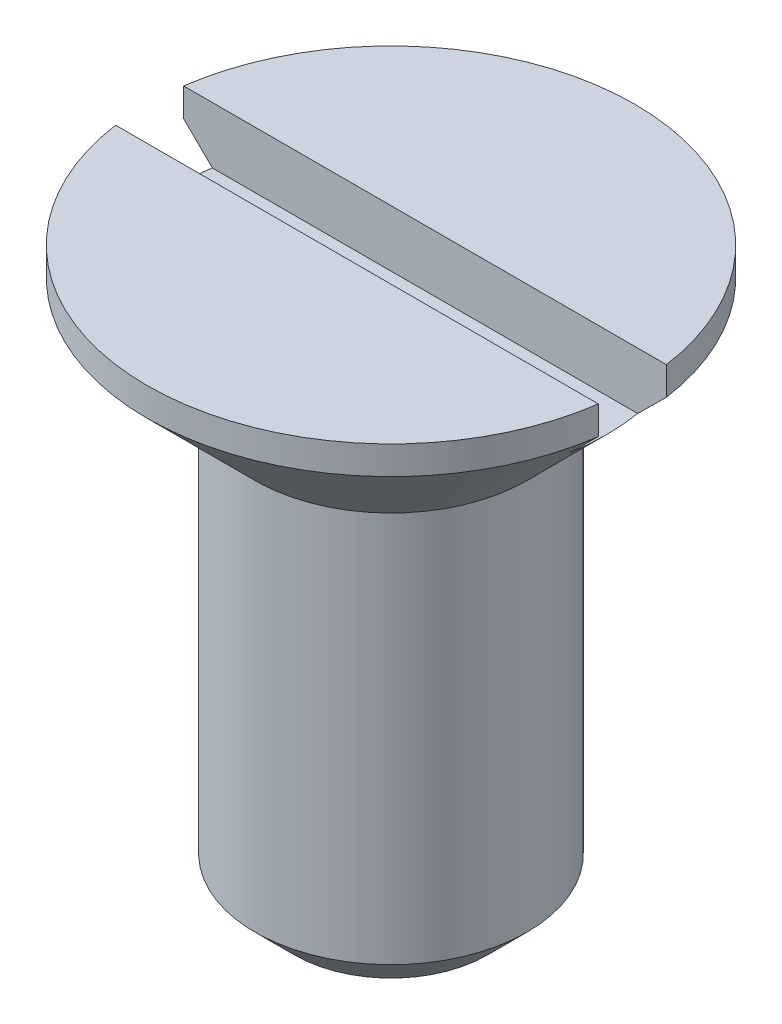
ISO-10303-21;
HEADER;
FILE_DESCRIPTION(('STEP AP214'),'2;1');
FILE_NAME('part.step','',(''),(''),'','','');
FILE_SCHEMA(('AUTOMOTIVE_DESIGN { 1 0 10303 214 1 1 1 1 }'));
ENDSEC;
DATA;
#1=APPLICATION_CONTEXT('core data for automotive mechanical design processes');
#2=APPLICATION_PROTOCOL_DEFINITION('international standard','automotive_design',2000,#1);
#3=PRODUCT_CONTEXT('',#1,'mechanical');
#4=PRODUCT('Part','Part','',(#3));
#5=PRODUCT_RELATED_PRODUCT_CATEGORY('part','',(#4));
#6=PRODUCT_DEFINITION_FORMATION('','',#4);
#7=PRODUCT_DEFINITION_CONTEXT('part definition',#1,'design');
#8=PRODUCT_DEFINITION('design','',#6,#7);
#9=PRODUCT_DEFINITION_SHAPE('','',#8);
#10=(LENGTH_UNIT() NAMED_UNIT(*) SI_UNIT(.MILLI.,.METRE.));
#11=(NAMED_UNIT(*) PLANE_ANGLE_UNIT() SI_UNIT($,.RADIAN.));
#12=(NAMED_UNIT(*) SI_UNIT($,.STERADIAN.) SOLID_ANGLE_UNIT());
#13=UNCERTAINTY_MEASURE_WITH_UNIT(LENGTH_MEASURE(1.E-05),#10,'distance_accuracy_value','');
#14=(GEOMETRIC_REPRESENTATION_CONTEXT(3) GLOBAL_UNCERTAINTY_ASSIGNED_CONTEXT((#13)) GLOBAL_UNIT_ASSIGNED_CONTEXT((#10,
#11,#12)) REPRESENTATION_CONTEXT('',''));
#15=CARTESIAN_POINT('',(0.,0.,0.));
#16=DIRECTION('',(0.,0.,1.));
#17=DIRECTION('',(1.,0.,0.));
#18=AXIS2_PLACEMENT_3D('',#15,#16,#17);
#19=CARTESIAN_POINT('',(0.,125.763182897862,0.));
#20=DIRECTION('',(0.,1.,0.));
#21=DIRECTION('',(-1.,0.,0.));
#22=AXIS2_PLACEMENT_3D('',#19,#20,#21);
#23=CYLINDRICAL_SURFACE('',#22,10.75);
#24=CARTESIAN_POINT('',(0.,90.7850422227854,0.));
#25=DIRECTION('',(0.,1.,0.));
#26=DIRECTION('',(-1.,0.,0.));
#27=AXIS2_PLACEMENT_3D('',#24,#25,#26);
#28=CIRCLE('',#27,10.75);
#29=CARTESIAN_POINT('',(10.6448344280219,90.7850422227854,-1.5));
#30=VERTEX_POINT('',#29);
#31=CARTESIAN_POINT('',(-10.6448344280219,90.7850422227854,-1.5));
#32=VERTEX_POINT('',#31);
#33=EDGE_CURVE('E103',#30,#32,#28,.T.);
#34=ORIENTED_EDGE('',*,*,#33,.T.);
#35=DIRECTION('',(0.,1.,0.));
#36=VECTOR('',#35,1.);
#37=CARTESIAN_POINT('',(-10.6448344280219,125.763182897862,-1.5));
#38=LINE('',#37,#36);
#39=CARTESIAN_POINT('',(-10.6448344280219,92.0350422227854,-1.5));
#40=VERTEX_POINT('',#39);
#41=EDGE_CURVE('E136',#32,#40,#38,.T.);
#42=ORIENTED_EDGE('',*,*,#41,.T.);
#43=CARTESIAN_POINT('',(0.,92.0350422227854,0.));
#44=DIRECTION('',(0.,1.,0.));
#45=DIRECTION('',(-1.,0.,0.));
#46=AXIS2_PLACEMENT_3D('',#43,#44,#45);
#47=CIRCLE('',#46,10.75);
#48=CARTESIAN_POINT('',(10.6448344280219,92.0350422227854,-1.5));
#49=VERTEX_POINT('',#48);
#50=EDGE_CURVE('E100',#49,#40,#47,.T.);
#51=ORIENTED_EDGE('',*,*,#50,.F.);
#52=DIRECTION('',(0.,1.,0.));
#53=VECTOR('',#52,1.);
#54=CARTESIAN_POINT('',(10.6448344280219,125.763182897862,-1.5));
#55=LINE('',#54,#53);
#56=EDGE_CURVE('E106',#49,#30,#55,.F.);
#57=ORIENTED_EDGE('',*,*,#56,.T.);
#58=EDGE_LOOP('',(#34,#42,#51,#57));
#59=FACE_BOUND('',#58,.T.);
#60=ADVANCED_FACE('F29',(#59),#23,.T.);
#61=CARTESIAN_POINT('',(0.,92.0350422227854,0.));
#62=DIRECTION('',(0.,-1.,0.));
#63=DIRECTION('',(1.,0.,0.));
#64=AXIS2_PLACEMENT_3D('',#61,#62,#63);
#65=PLANE('',#64);
#66=ORIENTED_EDGE('',*,*,#50,.T.);
#67=DIRECTION('',(1.,0.,0.));
#68=VECTOR('',#67,1.);
#69=CARTESIAN_POINT('',(0.,92.0350422227854,-1.5));
#70=LINE('',#69,#68);
#71=EDGE_CURVE('E88',#40,#49,#70,.T.);
#72=ORIENTED_EDGE('',*,*,#71,.T.);
#73=EDGE_LOOP('',(#66,#72));
#74=FACE_BOUND('',#73,.T.);
#75=ADVANCED_FACE('F162',(#74),#65,.F.);
#76=CARTESIAN_POINT('',(-10.6448344280219,90.7850422227854,1.5));
#77=VERTEX_POINT('',#76);
#78=CARTESIAN_POINT('',(10.6448344280219,90.7850422227854,1.5));
#79=VERTEX_POINT('',#78);
#80=EDGE_CURVE('E89',#77,#79,#28,.T.);
#81=ORIENTED_EDGE('',*,*,#80,.T.);
#82=DIRECTION('',(0.,1.,0.));
#83=VECTOR('',#82,1.);
#84=CARTESIAN_POINT('',(10.6448344280219,125.763182897862,1.5));
#85=LINE('',#84,#83);
#86=CARTESIAN_POINT('',(10.6448344280219,92.0350422227854,1.5));
#87=VERTEX_POINT('',#86);
#88=EDGE_CURVE('E83',#79,#87,#85,.T.);
#89=ORIENTED_EDGE('',*,*,#88,.T.);
#90=CARTESIAN_POINT('',(-10.6448344280219,92.0350422227854,1.5));
#91=VERTEX_POINT('',#90);
#92=EDGE_CURVE('E93',#91,#87,#47,.T.);
#93=ORIENTED_EDGE('',*,*,#92,.F.);
#94=DIRECTION('',(0.,1.,0.));
#95=VECTOR('',#94,1.);
#96=CARTESIAN_POINT('',(-10.6448344280219,125.763182897862,1.5));
#97=LINE('',#96,#95);
#98=EDGE_CURVE('E44',#91,#77,#97,.F.);
#99=ORIENTED_EDGE('',*,*,#98,.T.);
#100=EDGE_LOOP('',(#81,#89,#93,#99));
#101=FACE_BOUND('',#100,.T.);
#102=ADVANCED_FACE('F31',(#101),#23,.T.);
#103=CARTESIAN_POINT('',(0.,86.0350422227853,0.));
#104=DIRECTION('',(0.,1.,0.));
#105=DIRECTION('',(-1.,0.,0.));
#106=AXIS2_PLACEMENT_3D('',#103,#104,#105);
#107=CONICAL_SURFACE('',#106,6.00000000000001,0.785398163397446);
#108=ORIENTED_EDGE('',*,*,#33,.F.);
#109=CARTESIAN_POINT('',(23.624411596986,103.707026155354,-1.5));
#110=CARTESIAN_POINT('',(22.8154020730339,102.899654963907,-1.5));
#111=CARTESIAN_POINT('',(22.0063211030121,102.09235532134,-1.5));
#112=CARTESIAN_POINT('',(20.38791157067,100.477975758588,-1.5));
#113=CARTESIAN_POINT('',(19.578583004241,99.6708958425243,-1.5));
#114=CARTESIAN_POINT('',(17.9592825044704,98.0567422537327,-1.5));
#115=CARTESIAN_POINT('',(17.1493104432754,97.2496687092445,-1.5));
#116=CARTESIAN_POINT('',(15.5288870107924,95.6360307517758,-1.5));
#117=CARTESIAN_POINT('',(14.7184356479729,94.8294663302916,-1.5));
#118=CARTESIAN_POINT('',(13.0792147642803,93.1996838517726,-1.5));
#119=CARTESIAN_POINT('',(12.250428194927,92.3764829311697,-1.5));
#120=CARTESIAN_POINT('',(11.0061176502539,91.1427774538911,-1.5));
#121=CARTESIAN_POINT('',(10.5911479158948,90.7317139751827,-1.5));
#122=CARTESIAN_POINT('',(9.76068238489919,89.9101228651785,-1.5));
#123=CARTESIAN_POINT('',(9.34518659101676,89.4995952310999,-1.5));
#124=CARTESIAN_POINT('',(8.51352489200401,88.679425567348,-1.5));
#125=CARTESIAN_POINT('',(8.09735917858082,88.2697833433212,-1.5));
#126=CARTESIAN_POINT('',(7.26383278878102,87.4516978019751,-1.5));
#127=CARTESIAN_POINT('',(6.84647208861241,87.043254508859,-1.5));
#128=CARTESIAN_POINT('',(6.21894372829359,86.432154730021,-1.5));
#129=CARTESIAN_POINT('',(6.00952936257504,86.2287249587902,-1.5));
#130=CARTESIAN_POINT('',(5.59001644180387,85.8225723998325,-1.5));
#131=CARTESIAN_POINT('',(5.37991788828068,85.6198496105272,-1.5));
#132=CARTESIAN_POINT('',(4.95878084265641,85.2153958393719,-1.5));
#133=CARTESIAN_POINT('',(4.74774238114198,85.0136648256905,-1.5));
#134=CARTESIAN_POINT('',(4.32430836859011,84.6116331081041,-1.5));
#135=CARTESIAN_POINT('',(4.11191283486303,84.4113323860237,-1.5));
#136=CARTESIAN_POINT('',(3.84081355836716,84.1583211916163,-1.5));
#137=CARTESIAN_POINT('',(3.78306991295108,84.1045818685553,-1.5));
#138=CARTESIAN_POINT('',(3.66740822672036,83.9972909525488,-1.5));
#139=CARTESIAN_POINT('',(3.60949018544023,83.9437393601051,-1.5));
#140=CARTESIAN_POINT('',(3.4354398108812,83.7834021114899,-1.5));
#141=CARTESIAN_POINT('',(3.31901286719271,83.6769355175161,-1.5));
#142=CARTESIAN_POINT('',(3.08531290319807,83.4653047925097,-1.5));
#143=CARTESIAN_POINT('',(2.96804150124965,83.3601388766145,-1.5));
#144=CARTESIAN_POINT('',(2.73212240696763,83.1513637804755,-1.5));
#145=CARTESIAN_POINT('',(2.61347476008879,83.0477545490754,-1.5));
#146=CARTESIAN_POINT('',(2.41173762474932,82.8748829909893,-1.5));
#147=CARTESIAN_POINT('',(2.32915468585408,82.8050303984465,-1.5));
#148=CARTESIAN_POINT('',(2.16283340265828,82.6667164752204,-1.5));
#149=CARTESIAN_POINT('',(2.07909510370725,82.5982550901895,-1.5));
#150=CARTESIAN_POINT('',(1.90985816217855,82.4629963650576,-1.5));
#151=CARTESIAN_POINT('',(1.82435490820225,82.3962047727444,-1.5));
#152=CARTESIAN_POINT('',(1.65136756056971,82.2652462102402,-1.5));
#153=CARTESIAN_POINT('',(1.56388379992145,82.201078803829,-1.5));
#154=CARTESIAN_POINT('',(1.40270691912446,82.088071890869,-1.5));
#155=CARTESIAN_POINT('',(1.32946302171773,82.0385957353941,-1.5));
#156=CARTESIAN_POINT('',(1.18067290307648,81.9431101577513,-1.5));
#157=CARTESIAN_POINT('',(1.1051255020616,81.8971025554202,-1.5));
#158=CARTESIAN_POINT('',(0.951461297913383,81.8102266154584,-1.5));
#159=CARTESIAN_POINT('',(0.873355413142273,81.7693393159377,-1.5));
#160=CARTESIAN_POINT('',(0.713851621043405,81.6947436838452,-1.5));
#161=CARTESIAN_POINT('',(0.63245813577286,81.6610260666138,-1.5));
#162=CARTESIAN_POINT('',(0.459168034062907,81.6014897352946,-1.5));
#163=CARTESIAN_POINT('',(0.366955192195511,81.5765345585141,-1.5));
#164=CARTESIAN_POINT('',(0.226611999005804,81.5513626309236,-1.5));
#165=CARTESIAN_POINT('',(0.179560564904593,81.5450158100703,-1.5));
#166=CARTESIAN_POINT('',(0.0850620293282236,81.5367168746573,-1.5));
#167=CARTESIAN_POINT('',(0.0376149562684483,81.5347644471683,-1.5));
#168=CARTESIAN_POINT('',(-0.0574098244036544,81.5353852977373,-1.5));
#169=CARTESIAN_POINT('',(-0.104987424716811,81.537974055673,-1.5));
#170=CARTESIAN_POINT('',(-0.199695232556714,81.5475426178556,-1.5));
#171=CARTESIAN_POINT('',(-0.246825401283073,81.5545227994503,-1.5));
#172=CARTESIAN_POINT('',(-0.340447069538844,81.5725027513348,-1.5));
#173=CARTESIAN_POINT('',(-0.38693624156577,81.5835144628067,-1.5));
#174=CARTESIAN_POINT('',(-0.478934683025262,81.6090261406108,-1.5));
#175=CARTESIAN_POINT('',(-0.524443883832265,81.6235263503759,-1.5));
#176=CARTESIAN_POINT('',(-0.669223262379946,81.6749002124331,-1.5));
#177=CARTESIAN_POINT('',(-0.766454870690878,81.7175120730545,-1.5));
#178=CARTESIAN_POINT('',(-0.956302833634083,81.812036784642,-1.5));
#179=CARTESIAN_POINT('',(-1.04890925007297,81.8639686478542,-1.5));
#180=CARTESIAN_POINT('',(-1.23123129756668,81.9742772581994,-1.5));
#181=CARTESIAN_POINT('',(-1.32091577830701,82.0327048949298,-1.5));
#182=CARTESIAN_POINT('',(-1.45328616117674,82.1233477306043,-1.5));
#183=CARTESIAN_POINT('',(-1.49703053936489,82.1540473788034,-1.5));
#184=CARTESIAN_POINT('',(-1.58391173227593,82.2162934870605,-1.5));
#185=CARTESIAN_POINT('',(-1.62704856838231,82.2478399172005,-1.5));
#186=CARTESIAN_POINT('',(-1.76466045733875,82.350209918182,-1.5));
#187=CARTESIAN_POINT('',(-1.85812503408898,82.4223905104585,-1.5));
#188=CARTESIAN_POINT('',(-2.04319386963269,82.5691052356561,-1.5));
#189=CARTESIAN_POINT('',(-2.13479785882596,82.6436397057139,-1.5));
#190=CARTESIAN_POINT('',(-2.31663904565388,82.7944323063741,-1.5));
#191=CARTESIAN_POINT('',(-2.4068756370665,82.8706911661645,-1.5));
#192=CARTESIAN_POINT('',(-2.58627034672291,83.0244689712476,-1.5));
#193=CARTESIAN_POINT('',(-2.67542842997173,83.101987957238,-1.5));
#194=CARTESIAN_POINT('',(-2.94193959986333,83.336216879976,-1.5));
#195=CARTESIAN_POINT('',(-3.11803771295524,83.4943530944766,-1.5));
#196=CARTESIAN_POINT('',(-3.46806171087916,83.8129065997611,-1.5));
#197=CARTESIAN_POINT('',(-3.64198814645702,83.9733232891932,-1.5));
#198=CARTESIAN_POINT('',(-3.98758397218087,84.2949542860493,-1.5));
#199=CARTESIAN_POINT('',(-4.15926011671669,84.4561613440993,-1.5));
#200=CARTESIAN_POINT('',(-4.50161014550843,84.7796567709184,-1.5));
#201=CARTESIAN_POINT('',(-4.67228396312605,84.9419452100841,-1.5));
#202=CARTESIAN_POINT('',(-5.01272194555967,85.2671401451425,-1.5));
#203=CARTESIAN_POINT('',(-5.18248683710256,85.4300458808079,-1.5));
#204=CARTESIAN_POINT('',(-5.52145155705527,85.7564362341901,-1.5));
#205=CARTESIAN_POINT('',(-5.69065139793883,85.9199208389618,-1.5));
#206=CARTESIAN_POINT('',(-6.23355592293128,86.4458554559918,-1.5));
#207=CARTESIAN_POINT('',(-6.60643014890333,86.8091624474846,-1.5));
#208=CARTESIAN_POINT('',(-7.35093079223647,87.5370532821875,-1.5));
#209=CARTESIAN_POINT('',(-7.72255720472678,87.9016371303705,-1.5));
#210=CARTESIAN_POINT('',(-8.46499625843423,88.6316452745703,-1.5));
#211=CARTESIAN_POINT('',(-8.83580888526521,88.9970695852148,-1.5));
#212=CARTESIAN_POINT('',(-9.57687006923574,89.7284898283516,-1.5));
#213=CARTESIAN_POINT('',(-9.94711862606842,90.0944857611548,-1.5));
#214=CARTESIAN_POINT('',(-11.0576223393054,91.1934250390199,-1.5));
#215=CARTESIAN_POINT('',(-11.7972812577211,91.9269707895072,-1.5));
#216=CARTESIAN_POINT('',(-13.2757108892943,93.3949439897149,-1.5));
#217=CARTESIAN_POINT('',(-14.0144816097132,94.1293714321274,-1.5));
#218=CARTESIAN_POINT('',(-15.4931620866936,95.6004675046269,-1.5));
#219=CARTESIAN_POINT('',(-16.2330705717045,96.3371374127419,-1.5));
#220=CARTESIAN_POINT('',(-17.712522698451,97.8108475324603,-1.5));
#221=CARTESIAN_POINT('',(-18.4520663391679,98.5478877450864,-1.5));
#222=CARTESIAN_POINT('',(-19.93051564393,100.021840850873,-1.5));
#223=CARTESIAN_POINT('',(-20.6694214399066,100.758753611708,-1.5));
#224=CARTESIAN_POINT('',(-22.1470424690876,102.232765824661,-1.5));
#225=CARTESIAN_POINT('',(-22.8857577028458,102.969865276224,-1.5));
#226=CARTESIAN_POINT('',(-23.624411596986,103.707026155354,-1.5));
#227=B_SPLINE_CURVE_WITH_KNOTS('',3,(#109,#110,#111,#112,#113,#114,#115,#116,#117,#118,#119,
#120,#121,#122,#123,#124,#125,#126,#127,#128,#129,#130,#131,#132,#133,#134,#135,#136,#137,#138,
#139,#140,#141,#142,#143,#144,#145,#146,#147,#148,#149,#150,#151,#152,#153,#154,#155,#156,#157,
#158,#159,#160,#161,#162,#163,#164,#165,#166,#167,#168,#169,#170,#171,#172,#173,#174,#175,#176,
#177,#178,#179,#180,#181,#182,#183,#184,#185,#186,#187,#188,#189,#190,#191,#192,#193,#194,#195,
#196,#197,#198,#199,#200,#201,#202,#203,#204,#205,#206,#207,#208,#209,#210,#211,#212,#213,#214,
#215,#216,#217,#218,#219,#220,#221,#222,#223,#224,#225,#226),.UNSPECIFIED.,.F.,.F.,(4,2,2,2,2,2,
2,2,2,2,2,2,2,2,2,2,2,2,2,2,2,2,2,2,2,2,2,2,2,2,2,2,2,2,2,2,2,2,2,2,2,2,2,2,2,2,2,2,2,2,2,2,2,2,
2,2,2,2,4),(0.,3.42886309350741,6.85778656228902,10.2880636483011,13.7182818372926,
17.2226952392682,18.9749955963321,20.7272868167571,22.4791435392108,24.231035386824,
25.1069009669366,25.9827645904961,26.8585999168364,27.7344240935358,27.9710673180898,
28.2077111748352,28.6810056246309,29.1535558162491,29.6260904446251,29.9505697826346,
30.2750364203964,30.6004982254775,30.9259057070796,31.1910015938324,31.4562356135317,
31.7204563694616,31.9843328500591,32.2696327721111,32.4118869169945,32.5541309314947,
32.6968607664571,32.8396028676397,32.9827712300029,33.1259495857886,33.4435328381779,
33.7617714617256,34.0827071144155,34.2430270209344,34.4033412705487,34.7575543720677,
35.1118184382961,35.4662352213531,35.8206634736976,36.5306642820723,37.2404812167575,
37.9469752786077,38.6535157907362,39.3593648973079,40.065198317546,41.6270000724034,
43.1888079166062,44.750643151664,46.3124792361031,49.4376434827486,52.5627820031426,
55.6950850980883,58.8273968905744,61.958083633691,65.0887611737824),.UNSPECIFIED.);
#228=CARTESIAN_POINT('',(9.38083151964685,89.5350422227853,-1.5));
#229=VERTEX_POINT('',#228);
#230=EDGE_CURVE('E52',#30,#229,#227,.T.);
#231=ORIENTED_EDGE('',*,*,#230,.T.);
#232=CARTESIAN_POINT('',(0.,89.5350422227853,0.));
#233=DIRECTION('',(0.,1.,0.));
#234=DIRECTION('',(0.,0.,1.));
#235=AXIS2_PLACEMENT_3D('',#232,#233,#234);
#236=CIRCLE('',#235,9.5);
#237=CARTESIAN_POINT('',(9.38083151964685,89.5350422227853,1.5));
#238=VERTEX_POINT('',#237);
#239=EDGE_CURVE('E115',#238,#229,#236,.T.);
#240=ORIENTED_EDGE('',*,*,#239,.F.);
#241=CARTESIAN_POINT('',(-23.624411596986,103.707026155354,1.5));
#242=CARTESIAN_POINT('',(-22.8154020730339,102.899654963907,1.5));
#243=CARTESIAN_POINT('',(-22.0063211030121,102.09235532134,1.5));
#244=CARTESIAN_POINT('',(-20.38791157067,100.477975758588,1.5));
#245=CARTESIAN_POINT('',(-19.578583004241,99.6708958425243,1.5));
#246=CARTESIAN_POINT('',(-17.9592825044704,98.0567422537327,1.5));
#247=CARTESIAN_POINT('',(-17.1493104432754,97.2496687092445,1.5));
#248=CARTESIAN_POINT('',(-15.5288870107924,95.6360307517758,1.5));
#249=CARTESIAN_POINT('',(-14.7184356479729,94.8294663302916,1.5));
#250=CARTESIAN_POINT('',(-13.0792147642803,93.1996838517726,1.5));
#251=CARTESIAN_POINT('',(-12.250428194927,92.3764829311697,1.5));
#252=CARTESIAN_POINT('',(-11.0061176502539,91.1427774538911,1.5));
#253=CARTESIAN_POINT('',(-10.5911479158949,90.7317139751827,1.5));
#254=CARTESIAN_POINT('',(-9.76068238489921,89.9101228651785,1.5));
#255=CARTESIAN_POINT('',(-9.34518659101677,89.4995952310999,1.5));
#256=CARTESIAN_POINT('',(-8.51352489200403,88.679425567348,1.5));
#257=CARTESIAN_POINT('',(-8.09735917858084,88.2697833433212,1.5));
#258=CARTESIAN_POINT('',(-7.26383278878103,87.4516978019752,1.5));
#259=CARTESIAN_POINT('',(-6.84647208861243,87.043254508859,1.5));
#260=CARTESIAN_POINT('',(-6.21894372829361,86.432154730021,1.5));
#261=CARTESIAN_POINT('',(-6.00952936257505,86.2287249587902,1.5));
#262=CARTESIAN_POINT('',(-5.59001644180388,85.8225723998325,1.5));
#263=CARTESIAN_POINT('',(-5.37991788828069,85.6198496105272,1.5));
#264=CARTESIAN_POINT('',(-4.95878084265643,85.2153958393719,1.5));
#265=CARTESIAN_POINT('',(-4.74774238114199,85.0136648256905,1.5));
#266=CARTESIAN_POINT('',(-4.32430836859012,84.6116331081041,1.5));
#267=CARTESIAN_POINT('',(-4.11191283486304,84.4113323860237,1.5));
#268=CARTESIAN_POINT('',(-3.84081355836717,84.1583211916163,1.5));
#269=CARTESIAN_POINT('',(-3.7830699129511,84.1045818685553,1.5));
#270=CARTESIAN_POINT('',(-3.66740822672037,83.9972909525488,1.5));
#271=CARTESIAN_POINT('',(-3.60949018544024,83.9437393601051,1.5));
#272=CARTESIAN_POINT('',(-3.43543981088122,83.7834021114899,1.5));
#273=CARTESIAN_POINT('',(-3.31901286719273,83.6769355175161,1.5));
#274=CARTESIAN_POINT('',(-3.08531290319808,83.4653047925097,1.5));
#275=CARTESIAN_POINT('',(-2.96804150124966,83.3601388766145,1.5));
#276=CARTESIAN_POINT('',(-2.73212240696765,83.1513637804755,1.5));
#277=CARTESIAN_POINT('',(-2.6134747600888,83.0477545490754,1.5));
#278=CARTESIAN_POINT('',(-2.41173762474933,82.8748829909893,1.5));
#279=CARTESIAN_POINT('',(-2.3291546858541,82.8050303984465,1.5));
#280=CARTESIAN_POINT('',(-2.16283340265829,82.6667164752204,1.5));
#281=CARTESIAN_POINT('',(-2.07909510370726,82.5982550901895,1.5));
#282=CARTESIAN_POINT('',(-1.90985816217856,82.4629963650576,1.5));
#283=CARTESIAN_POINT('',(-1.82435490820226,82.3962047727444,1.5));
#284=CARTESIAN_POINT('',(-1.65136756056972,82.2652462102402,1.5));
#285=CARTESIAN_POINT('',(-1.56388379992146,82.201078803829,1.5));
#286=CARTESIAN_POINT('',(-1.40270691912448,82.088071890869,1.5));
#287=CARTESIAN_POINT('',(-1.32946302171774,82.0385957353941,1.5));
#288=CARTESIAN_POINT('',(-1.18067290307649,81.9431101577513,1.5));
#289=CARTESIAN_POINT('',(-1.10512550206161,81.8971025554202,1.5));
#290=CARTESIAN_POINT('',(-0.951461297913394,81.8102266154584,1.5));
#291=CARTESIAN_POINT('',(-0.873355413142281,81.7693393159377,1.5));
#292=CARTESIAN_POINT('',(-0.713851621043413,81.6947436838452,1.5));
#293=CARTESIAN_POINT('',(-0.63245813577287,81.6610260666138,1.5));
#294=CARTESIAN_POINT('',(-0.45916803406292,81.6014897352946,1.5));
#295=CARTESIAN_POINT('',(-0.366955192195523,81.5765345585141,1.5));
#296=CARTESIAN_POINT('',(-0.226611999005814,81.5513626309236,1.5));
#297=CARTESIAN_POINT('',(-0.1795605649046,81.5450158100703,1.5));
#298=CARTESIAN_POINT('',(-0.0850620293282309,81.5367168746573,1.5));
#299=CARTESIAN_POINT('',(-0.0376149562684579,81.5347644471683,1.5));
#300=CARTESIAN_POINT('',(0.0574098244036424,81.5353852977373,1.5));
#301=CARTESIAN_POINT('',(0.104987424716799,81.537974055673,1.5));
#302=CARTESIAN_POINT('',(0.199695232556702,81.5475426178556,1.5));
#303=CARTESIAN_POINT('',(0.246825401283062,81.5545227994503,1.5));
#304=CARTESIAN_POINT('',(0.340447069538835,81.5725027513348,1.5));
#305=CARTESIAN_POINT('',(0.386936241565761,81.5835144628068,1.5));
#306=CARTESIAN_POINT('',(0.478934683025253,81.6090261406108,1.5));
#307=CARTESIAN_POINT('',(0.524443883832255,81.6235263503759,1.5));
#308=CARTESIAN_POINT('',(0.669223262379937,81.6749002124331,1.5));
#309=CARTESIAN_POINT('',(0.766454870690867,81.7175120730545,1.5));
#310=CARTESIAN_POINT('',(0.95630283363407,81.812036784642,1.5));
#311=CARTESIAN_POINT('',(1.04890925007296,81.8639686478542,1.5));
#312=CARTESIAN_POINT('',(1.23123129756667,81.9742772581994,1.5));
#313=CARTESIAN_POINT('',(1.320915778307,82.0327048949298,1.5));
#314=CARTESIAN_POINT('',(1.45328616117673,82.1233477306043,1.5));
#315=CARTESIAN_POINT('',(1.49703053936488,82.1540473788034,1.5));
#316=CARTESIAN_POINT('',(1.58391173227592,82.2162934870605,1.5));
#317=CARTESIAN_POINT('',(1.6270485683823,82.2478399172005,1.5));
#318=CARTESIAN_POINT('',(1.76466045733874,82.350209918182,1.5));
#319=CARTESIAN_POINT('',(1.85812503408897,82.4223905104585,1.5));
#320=CARTESIAN_POINT('',(2.04319386963268,82.5691052356561,1.5));
#321=CARTESIAN_POINT('',(2.13479785882595,82.6436397057139,1.5));
#322=CARTESIAN_POINT('',(2.31663904565386,82.7944323063741,1.5));
#323=CARTESIAN_POINT('',(2.40687563706649,82.8706911661645,1.5));
#324=CARTESIAN_POINT('',(2.5862703467229,83.0244689712476,1.5));
#325=CARTESIAN_POINT('',(2.67542842997171,83.101987957238,1.5));
#326=CARTESIAN_POINT('',(2.94193959986332,83.336216879976,1.5));
#327=CARTESIAN_POINT('',(3.11803771295523,83.4943530944766,1.5));
#328=CARTESIAN_POINT('',(3.46806171087915,83.8129065997611,1.5));
#329=CARTESIAN_POINT('',(3.64198814645701,83.9733232891932,1.5));
#330=CARTESIAN_POINT('',(3.98758397218086,84.2949542860493,1.5));
#331=CARTESIAN_POINT('',(4.15926011671668,84.4561613440993,1.5));
#332=CARTESIAN_POINT('',(4.50161014550843,84.7796567709184,1.5));
#333=CARTESIAN_POINT('',(4.67228396312604,84.9419452100841,1.5));
#334=CARTESIAN_POINT('',(5.01272194555967,85.2671401451425,1.5));
#335=CARTESIAN_POINT('',(5.18248683710256,85.4300458808079,1.5));
#336=CARTESIAN_POINT('',(5.52145155705526,85.7564362341901,1.5));
#337=CARTESIAN_POINT('',(5.69065139793883,85.9199208389618,1.5));
#338=CARTESIAN_POINT('',(6.23355592293128,86.4458554559918,1.5));
#339=CARTESIAN_POINT('',(6.60643014890332,86.8091624474846,1.5));
#340=CARTESIAN_POINT('',(7.35093079223646,87.5370532821876,1.5));
#341=CARTESIAN_POINT('',(7.72255720472678,87.9016371303705,1.5));
#342=CARTESIAN_POINT('',(8.46499625843424,88.6316452745703,1.5));
#343=CARTESIAN_POINT('',(8.83580888526522,88.9970695852148,1.5));
#344=CARTESIAN_POINT('',(9.57687006923575,89.7284898283517,1.5));
#345=CARTESIAN_POINT('',(9.94711862606843,90.0944857611548,1.5));
#346=CARTESIAN_POINT('',(11.0576223393054,91.1934250390199,1.5));
#347=CARTESIAN_POINT('',(11.7972812577212,91.9269707895072,1.5));
#348=CARTESIAN_POINT('',(13.2757108892943,93.3949439897149,1.5));
#349=CARTESIAN_POINT('',(14.0144816097132,94.1293714321274,1.5));
#350=CARTESIAN_POINT('',(15.4931620866936,95.600467504627,1.5));
#351=CARTESIAN_POINT('',(16.2330705717045,96.3371374127419,1.5));
#352=CARTESIAN_POINT('',(17.712522698451,97.8108475324603,1.5));
#353=CARTESIAN_POINT('',(18.4520663391679,98.5478877450864,1.5));
#354=CARTESIAN_POINT('',(19.93051564393,100.021840850873,1.5));
#355=CARTESIAN_POINT('',(20.6694214399066,100.758753611708,1.5));
#356=CARTESIAN_POINT('',(22.1470424690876,102.232765824661,1.5));
#357=CARTESIAN_POINT('',(22.8857577028458,102.969865276224,1.5));
#358=CARTESIAN_POINT('',(23.624411596986,103.707026155354,1.5));
#359=B_SPLINE_CURVE_WITH_KNOTS('',3,(#241,#242,#243,#244,#245,#246,#247,#248,#249,#250,#251,
#252,#253,#254,#255,#256,#257,#258,#259,#260,#261,#262,#263,#264,#265,#266,#267,#268,#269,#270,
#271,#272,#273,#274,#275,#276,#277,#278,#279,#280,#281,#282,#283,#284,#285,#286,#287,#288,#289,
#290,#291,#292,#293,#294,#295,#296,#297,#298,#299,#300,#301,#302,#303,#304,#305,#306,#307,#308,
#309,#310,#311,#312,#313,#314,#315,#316,#317,#318,#319,#320,#321,#322,#323,#324,#325,#326,#327,
#328,#329,#330,#331,#332,#333,#334,#335,#336,#337,#338,#339,#340,#341,#342,#343,#344,#345,#346,
#347,#348,#349,#350,#351,#352,#353,#354,#355,#356,#357,#358),.UNSPECIFIED.,.F.,.F.,(4,2,2,2,2,2,
2,2,2,2,2,2,2,2,2,2,2,2,2,2,2,2,2,2,2,2,2,2,2,2,2,2,2,2,2,2,2,2,2,2,2,2,2,2,2,2,2,2,2,2,2,2,2,2,
2,2,2,2,4),(0.,3.42886309350741,6.85778656228902,10.2880636483011,13.7182818372926,
17.2226952392681,18.9749955963321,20.7272868167571,22.4791435392108,24.231035386824,
25.1069009669366,25.9827645904961,26.8585999168364,27.7344240935358,27.9710673180898,
28.2077111748352,28.6810056246309,29.1535558162491,29.6260904446251,29.9505697826346,
30.2750364203964,30.6004982254775,30.9259057070796,31.1910015938324,31.4562356135317,
31.7204563694616,31.9843328500591,32.2696327721111,32.4118869169946,32.5541309314947,
32.6968607664571,32.8396028676397,32.982771230003,33.1259495857886,33.4435328381779,
33.7617714617256,34.0827071144155,34.2430270209344,34.4033412705487,34.7575543720677,
35.1118184382961,35.4662352213531,35.8206634736976,36.5306642820723,37.2404812167575,
37.9469752786077,38.6535157907362,39.3593648973079,40.065198317546,41.6270000724034,
43.1888079166062,44.750643151664,46.3124792361031,49.4376434827487,52.5627820031427,
55.6950850980883,58.8273968905744,61.958083633691,65.0887611737824),.UNSPECIFIED.);
#360=EDGE_CURVE('E96',#238,#79,#359,.T.);
#361=ORIENTED_EDGE('',*,*,#360,.T.);
#362=ORIENTED_EDGE('',*,*,#80,.F.);
#363=CARTESIAN_POINT('',(-9.38083151964687,89.5350422227853,1.5));
#364=VERTEX_POINT('',#363);
#365=EDGE_CURVE('E95',#77,#364,#359,.T.);
#366=ORIENTED_EDGE('',*,*,#365,.T.);
#367=CARTESIAN_POINT('',(-9.38083151964687,89.5350422227853,-1.5));
#368=VERTEX_POINT('',#367);
#369=EDGE_CURVE('E114',#368,#364,#236,.T.);
#370=ORIENTED_EDGE('',*,*,#369,.F.);
#371=EDGE_CURVE('E131',#368,#32,#227,.T.);
#372=ORIENTED_EDGE('',*,*,#371,.T.);
#373=EDGE_LOOP('',(#108,#231,#240,#361,#362,#366,#370,#372));
#374=FACE_BOUND('',#373,.T.);
#375=CARTESIAN_POINT('',(0.,86.0350422227853,0.));
#376=DIRECTION('',(0.,1.,0.));
#377=DIRECTION('',(-1.,0.,0.));
#378=AXIS2_PLACEMENT_3D('',#375,#376,#377);
#379=CIRCLE('',#378,6.00000000000001);
#380=CARTESIAN_POINT('',(-6.00000000000002,86.0350422227853,0.));
#381=VERTEX_POINT('',#380);
#382=EDGE_CURVE('E99',#381,#381,#379,.T.);
#383=ORIENTED_EDGE('',*,*,#382,.T.);
#384=EDGE_LOOP('',(#383));
#385=FACE_BOUND('',#384,.T.);
#386=ADVANCED_FACE('F134',(#374,#385),#107,.T.);
#387=CARTESIAN_POINT('',(0.,125.763182897862,0.));
#388=DIRECTION('',(0.,1.,0.));
#389=DIRECTION('',(-1.,0.,0.));
#390=AXIS2_PLACEMENT_3D('',#387,#388,#389);
#391=CYLINDRICAL_SURFACE('',#390,6.00000000000001);
#392=CARTESIAN_POINT('',(0.,68.7850422227853,0.));
#393=DIRECTION('',(0.,1.,0.));
#394=DIRECTION('',(-1.,0.,0.));
#395=AXIS2_PLACEMENT_3D('',#392,#393,#394);
#396=CIRCLE('',#395,6.00000000000001);
#397=CARTESIAN_POINT('',(-6.00000000000002,68.7850422227853,0.));
#398=VERTEX_POINT('',#397);
#399=EDGE_CURVE('E37',#398,#398,#396,.T.);
#400=ORIENTED_EDGE('',*,*,#399,.T.);
#401=EDGE_LOOP('',(#400));
#402=FACE_BOUND('',#401,.T.);
#403=ORIENTED_EDGE('',*,*,#382,.F.);
#404=EDGE_LOOP('',(#403));
#405=FACE_BOUND('',#404,.T.);
#406=ADVANCED_FACE('F164',(#402,#405),#391,.T.);
#407=CARTESIAN_POINT('',(6.00000000000001,67.0350422227854,0.));
#408=DIRECTION('',(0.,1.,0.));
#409=DIRECTION('',(-1.,0.,0.));
#410=AXIS2_PLACEMENT_3D('',#407,#408,#409);
#411=PLANE('',#410);
#412=CARTESIAN_POINT('',(0.,67.0350422227854,0.));
#413=DIRECTION('',(0.,1.,0.));
#414=DIRECTION('',(-1.,0.,0.));
#415=AXIS2_PLACEMENT_3D('',#412,#413,#414);
#416=CIRCLE('',#415,4.25000000000002);
#417=CARTESIAN_POINT('',(-4.25000000000003,67.0350422227854,0.));
#418=VERTEX_POINT('',#417);
#419=EDGE_CURVE('E11',#418,#418,#416,.F.);
#420=ORIENTED_EDGE('',*,*,#419,.T.);
#421=EDGE_LOOP('',(#420));
#422=FACE_BOUND('',#421,.T.);
#423=ADVANCED_FACE('F161',(#422),#411,.F.);
#424=ORIENTED_EDGE('',*,*,#92,.T.);
#425=DIRECTION('',(-1.,0.,0.));
#426=VECTOR('',#425,1.);
#427=CARTESIAN_POINT('',(0.,92.0350422227854,1.5));
#428=LINE('',#427,#426);
#429=EDGE_CURVE('E80',#87,#91,#428,.T.);
#430=ORIENTED_EDGE('',*,*,#429,.T.);
#431=EDGE_LOOP('',(#424,#430));
#432=FACE_BOUND('',#431,.T.);
#433=ADVANCED_FACE('F98',(#432),#65,.F.);
#434=CARTESIAN_POINT('',(-10.75,89.5350422227853,1.5));
#435=DIRECTION('',(0.,1.,0.));
#436=DIRECTION('',(0.,0.,1.));
#437=AXIS2_PLACEMENT_3D('',#434,#435,#436);
#438=PLANE('',#437);
#439=ORIENTED_EDGE('',*,*,#239,.T.);
#440=DIRECTION('',(-1.,0.,0.));
#441=VECTOR('',#440,1.);
#442=CARTESIAN_POINT('',(-10.75,89.5350422227853,-1.5));
#443=LINE('',#442,#441);
#444=EDGE_CURVE('E124',#229,#368,#443,.T.);
#445=ORIENTED_EDGE('',*,*,#444,.T.);
#446=ORIENTED_EDGE('',*,*,#369,.T.);
#447=DIRECTION('',(1.,0.,0.));
#448=VECTOR('',#447,1.);
#449=CARTESIAN_POINT('',(-10.75,89.5350422227853,1.5));
#450=LINE('',#449,#448);
#451=EDGE_CURVE('E127',#364,#238,#450,.T.);
#452=ORIENTED_EDGE('',*,*,#451,.T.);
#453=EDGE_LOOP('',(#439,#445,#446,#452));
#454=FACE_BOUND('',#453,.T.);
#455=ADVANCED_FACE('F123',(#454),#438,.T.);
#456=CARTESIAN_POINT('',(-10.75,89.5350422227853,-1.5));
#457=DIRECTION('',(0.,0.,-1.));
#458=DIRECTION('',(-1.,0.,0.));
#459=AXIS2_PLACEMENT_3D('',#456,#457,#458);
#460=PLANE('',#459);
#461=ORIENTED_EDGE('',*,*,#71,.F.);
#462=ORIENTED_EDGE('',*,*,#41,.F.);
#463=ORIENTED_EDGE('',*,*,#371,.F.);
#464=ORIENTED_EDGE('',*,*,#444,.F.);
#465=ORIENTED_EDGE('',*,*,#230,.F.);
#466=ORIENTED_EDGE('',*,*,#56,.F.);
#467=EDGE_LOOP('',(#461,#462,#463,#464,#465,#466));
#468=FACE_BOUND('',#467,.T.);
#469=ADVANCED_FACE('F129',(#468),#460,.F.);
#470=CARTESIAN_POINT('',(-10.75,89.5350422227853,1.5));
#471=DIRECTION('',(0.,0.,1.));
#472=DIRECTION('',(1.,0.,0.));
#473=AXIS2_PLACEMENT_3D('',#470,#471,#472);
#474=PLANE('',#473);
#475=ORIENTED_EDGE('',*,*,#429,.F.);
#476=ORIENTED_EDGE('',*,*,#88,.F.);
#477=ORIENTED_EDGE('',*,*,#360,.F.);
#478=ORIENTED_EDGE('',*,*,#451,.F.);
#479=ORIENTED_EDGE('',*,*,#365,.F.);
#480=ORIENTED_EDGE('',*,*,#98,.F.);
#481=EDGE_LOOP('',(#475,#476,#477,#478,#479,#480));
#482=FACE_BOUND('',#481,.T.);
#483=ADVANCED_FACE('F82',(#482),#474,.F.);
#484=CARTESIAN_POINT('',(0.,68.7850422227853,0.));
#485=DIRECTION('',(0.,1.,0.));
#486=DIRECTION('',(-1.,0.,0.));
#487=AXIS2_PLACEMENT_3D('',#484,#485,#486);
#488=CONICAL_SURFACE('',#487,6.00000000000001,0.785398163397449);
#489=ORIENTED_EDGE('',*,*,#419,.F.);
#490=EDGE_LOOP('',(#489));
#491=FACE_BOUND('',#490,.T.);
#492=ORIENTED_EDGE('',*,*,#399,.F.);
#493=EDGE_LOOP('',(#492));
#494=FACE_BOUND('',#493,.T.);
#495=ADVANCED_FACE('F156',(#491,#494),#488,.T.);
#496=CLOSED_SHELL('',(#60,#75,#102,#386,#406,#423,#433,#455,#469,#483,#495));
#497=MANIFOLD_SOLID_BREP('B2',#496);
#498=ADVANCED_BREP_SHAPE_REPRESENTATION('',(#18,#497),#14);
#499=SHAPE_DEFINITION_REPRESENTATION(#9,#498);
ENDSEC;
END-ISO-10303-21;
